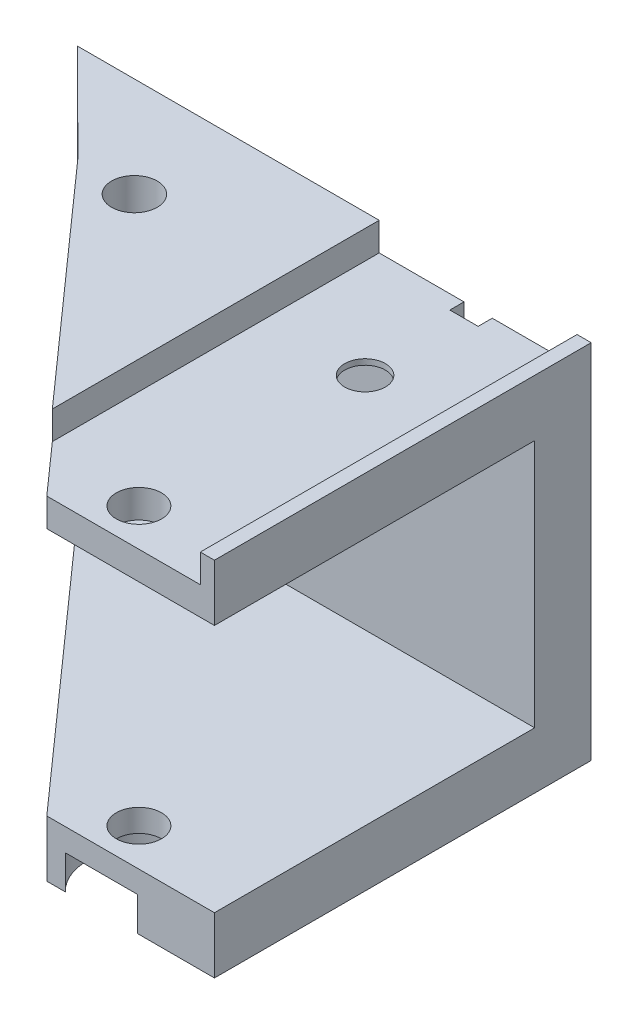
ISO-10303-21;
HEADER;
FILE_DESCRIPTION(('STEP AP214'),'2;1');
FILE_NAME('part.step','',(''),(''),'','','');
FILE_SCHEMA(('AUTOMOTIVE_DESIGN { 1 0 10303 214 1 1 1 1 }'));
ENDSEC;
DATA;
#1=APPLICATION_CONTEXT('core data for automotive mechanical design processes');
#2=APPLICATION_PROTOCOL_DEFINITION('international standard','automotive_design',2000,#1);
#3=PRODUCT_CONTEXT('',#1,'mechanical');
#4=PRODUCT('Part','Part','',(#3));
#5=PRODUCT_RELATED_PRODUCT_CATEGORY('part','',(#4));
#6=PRODUCT_DEFINITION_FORMATION('','',#4);
#7=PRODUCT_DEFINITION_CONTEXT('part definition',#1,'design');
#8=PRODUCT_DEFINITION('design','',#6,#7);
#9=PRODUCT_DEFINITION_SHAPE('','',#8);
#10=(LENGTH_UNIT() NAMED_UNIT(*) SI_UNIT(.MILLI.,.METRE.));
#11=(NAMED_UNIT(*) PLANE_ANGLE_UNIT() SI_UNIT($,.RADIAN.));
#12=(NAMED_UNIT(*) SI_UNIT($,.STERADIAN.) SOLID_ANGLE_UNIT());
#13=UNCERTAINTY_MEASURE_WITH_UNIT(LENGTH_MEASURE(1.E-05),#10,'distance_accuracy_value','');
#14=(GEOMETRIC_REPRESENTATION_CONTEXT(3) GLOBAL_UNCERTAINTY_ASSIGNED_CONTEXT((#13)) GLOBAL_UNIT_ASSIGNED_CONTEXT((#10,
#11,#12)) REPRESENTATION_CONTEXT('',''));
#15=CARTESIAN_POINT('',(0.,0.,0.));
#16=DIRECTION('',(0.,0.,1.));
#17=DIRECTION('',(1.,0.,0.));
#18=AXIS2_PLACEMENT_3D('',#15,#16,#17);
#19=CARTESIAN_POINT('',(38.1,-34.29,31.75));
#20=DIRECTION('',(0.,1.,0.));
#21=DIRECTION('',(0.,0.,1.));
#22=AXIS2_PLACEMENT_3D('',#19,#20,#21);
#23=CYLINDRICAL_SURFACE('',#22,2.54);
#24=CARTESIAN_POINT('',(38.1,-27.94,31.75));
#25=DIRECTION('',(0.,-1.,0.));
#26=DIRECTION('',(0.,0.,-1.));
#27=AXIS2_PLACEMENT_3D('',#24,#25,#26);
#28=CIRCLE('',#27,2.54);
#29=CARTESIAN_POINT('',(38.1,-27.94,29.21));
#30=VERTEX_POINT('',#29);
#31=EDGE_CURVE('E325',#30,#30,#28,.T.);
#32=ORIENTED_EDGE('',*,*,#31,.F.);
#33=EDGE_LOOP('',(#32));
#34=FACE_BOUND('',#33,.T.);
#35=CARTESIAN_POINT('',(38.1,-30.48,31.75));
#36=DIRECTION('',(0.,-1.,0.));
#37=DIRECTION('',(0.,0.,-1.));
#38=AXIS2_PLACEMENT_3D('',#35,#36,#37);
#39=CIRCLE('',#38,2.54);
#40=CARTESIAN_POINT('',(38.1,-30.48,29.21));
#41=VERTEX_POINT('',#40);
#42=EDGE_CURVE('E257',#41,#41,#39,.T.);
#43=ORIENTED_EDGE('',*,*,#42,.T.);
#44=EDGE_LOOP('',(#43));
#45=FACE_BOUND('',#44,.T.);
#46=ADVANCED_FACE('F43',(#34,#45),#23,.F.);
#47=CARTESIAN_POINT('',(0.,0.,-6.35));
#48=DIRECTION('',(0.,0.,-1.));
#49=DIRECTION('',(-1.,0.,0.));
#50=AXIS2_PLACEMENT_3D('',#47,#48,#49);
#51=PLANE('',#50);
#52=DIRECTION('',(0.,-1.,0.));
#53=VECTOR('',#52,1.);
#54=CARTESIAN_POINT('',(39.6875,3.175,-6.35));
#55=LINE('',#54,#53);
#56=CARTESIAN_POINT('',(39.6875,3.175,-6.35));
#57=VERTEX_POINT('',#56);
#58=CARTESIAN_POINT('',(39.6875,-34.29,-6.35));
#59=VERTEX_POINT('',#58);
#60=EDGE_CURVE('E272',#57,#59,#55,.T.);
#61=ORIENTED_EDGE('',*,*,#60,.F.);
#62=DIRECTION('',(-1.,0.,0.));
#63=VECTOR('',#62,1.);
#64=CARTESIAN_POINT('',(26.9875,3.175,-6.35));
#65=LINE('',#64,#63);
#66=CARTESIAN_POINT('',(49.2125,3.175,-6.35));
#67=VERTEX_POINT('',#66);
#68=EDGE_CURVE('E305',#67,#57,#65,.T.);
#69=ORIENTED_EDGE('',*,*,#68,.F.);
#70=DIRECTION('',(0.,1.,0.));
#71=VECTOR('',#70,1.);
#72=CARTESIAN_POINT('',(49.2125,3.175,-6.35));
#73=LINE('',#72,#71);
#74=CARTESIAN_POINT('',(49.2125,6.35,-6.35));
#75=VERTEX_POINT('',#74);
#76=EDGE_CURVE('E315',#67,#75,#73,.T.);
#77=ORIENTED_EDGE('',*,*,#76,.T.);
#78=DIRECTION('',(-1.,0.,0.));
#79=VECTOR('',#78,1.);
#80=CARTESIAN_POINT('',(0.,6.35,-6.35));
#81=LINE('',#80,#79);
#82=CARTESIAN_POINT('',(50.8,6.35,-6.35));
#83=VERTEX_POINT('',#82);
#84=EDGE_CURVE('E352',#83,#75,#81,.T.);
#85=ORIENTED_EDGE('',*,*,#84,.F.);
#86=DIRECTION('',(0.,1.,0.));
#87=VECTOR('',#86,1.);
#88=CARTESIAN_POINT('',(50.8,0.,-6.35));
#89=LINE('',#88,#87);
#90=CARTESIAN_POINT('',(50.8,-34.29,-6.35));
#91=VERTEX_POINT('',#90);
#92=EDGE_CURVE('E355',#91,#83,#89,.T.);
#93=ORIENTED_EDGE('',*,*,#92,.F.);
#94=DIRECTION('',(1.,0.,0.));
#95=VECTOR('',#94,1.);
#96=CARTESIAN_POINT('',(0.,-34.29,-6.35));
#97=LINE('',#96,#95);
#98=EDGE_CURVE('E195',#59,#91,#97,.T.);
#99=ORIENTED_EDGE('',*,*,#98,.F.);
#100=EDGE_LOOP('',(#61,#69,#77,#85,#93,#99));
#101=FACE_BOUND('',#100,.T.);
#102=ADVANCED_FACE('F392',(#101),#51,.T.);
#103=CARTESIAN_POINT('',(38.1,6.35,6.35));
#104=DIRECTION('',(0.,-1.,0.));
#105=DIRECTION('',(0.,0.,-1.));
#106=AXIS2_PLACEMENT_3D('',#103,#104,#105);
#107=CYLINDRICAL_SURFACE('',#106,2.28599999999999);
#108=CARTESIAN_POINT('',(38.1,2.54,6.35));
#109=DIRECTION('',(0.,-1.,0.));
#110=DIRECTION('',(0.,0.,-1.));
#111=AXIS2_PLACEMENT_3D('',#108,#109,#110);
#112=CIRCLE('',#111,2.28599999999999);
#113=CARTESIAN_POINT('',(38.1,2.54,4.06400000000001));
#114=VERTEX_POINT('',#113);
#115=EDGE_CURVE('E341',#114,#114,#112,.T.);
#116=ORIENTED_EDGE('',*,*,#115,.T.);
#117=EDGE_LOOP('',(#116));
#118=FACE_BOUND('',#117,.T.);
#119=CARTESIAN_POINT('',(38.1,3.175,6.35));
#120=DIRECTION('',(0.,1.,0.));
#121=DIRECTION('',(0.,0.,1.));
#122=AXIS2_PLACEMENT_3D('',#119,#120,#121);
#123=CIRCLE('',#122,2.28599999999999);
#124=CARTESIAN_POINT('',(38.1,3.175,8.636));
#125=VERTEX_POINT('',#124);
#126=EDGE_CURVE('E322',#125,#125,#123,.T.);
#127=ORIENTED_EDGE('',*,*,#126,.T.);
#128=EDGE_LOOP('',(#127));
#129=FACE_BOUND('',#128,.T.);
#130=ADVANCED_FACE('F400',(#118,#129),#107,.F.);
#131=CARTESIAN_POINT('',(0.,6.35,0.));
#132=DIRECTION('',(0.,-1.,0.));
#133=DIRECTION('',(0.,0.,-1.));
#134=AXIS2_PLACEMENT_3D('',#131,#132,#133);
#135=PLANE('',#134);
#136=CARTESIAN_POINT('',(10.6998859012606,6.35,4.85715743153037));
#137=DIRECTION('',(0.,1.,0.));
#138=DIRECTION('',(0.,0.,1.));
#139=AXIS2_PLACEMENT_3D('',#136,#137,#138);
#140=CIRCLE('',#139,2.56429102743881);
#141=CARTESIAN_POINT('',(10.6998859012606,6.35,7.42144845896918));
#142=VERTEX_POINT('',#141);
#143=EDGE_CURVE('E277',#142,#142,#140,.T.);
#144=ORIENTED_EDGE('',*,*,#143,.F.);
#145=EDGE_LOOP('',(#144));
#146=FACE_BOUND('',#145,.T.);
#147=CARTESIAN_POINT('',(26.9875,6.35,-6.35));
#148=VERTEX_POINT('',#147);
#149=CARTESIAN_POINT('',(-6.91548589679075,6.35,-6.35));
#150=VERTEX_POINT('',#149);
#151=EDGE_CURVE('E351',#148,#150,#81,.T.);
#152=ORIENTED_EDGE('',*,*,#151,.T.);
#153=DIRECTION('',(0.709263598483506,0.,0.704943365006174));
#154=VECTOR('',#153,1.);
#155=CARTESIAN_POINT('',(-6.91548589679075,6.35,-6.35));
#156=LINE('',#155,#154);
#157=CARTESIAN_POINT('',(3.99235643502804,6.35,4.49140098940655));
#158=VERTEX_POINT('',#157);
#159=EDGE_CURVE('E211',#150,#158,#156,.T.);
#160=ORIENTED_EDGE('',*,*,#159,.T.);
#161=DIRECTION('',(0.66436383882992,0.,0.74740931868366));
#162=VECTOR('',#161,1.);
#163=CARTESIAN_POINT('',(50.8,6.35,57.15));
#164=LINE('',#163,#162);
#165=CARTESIAN_POINT('',(26.9875,6.35,30.3609375));
#166=VERTEX_POINT('',#165);
#167=EDGE_CURVE('E362',#158,#166,#164,.T.);
#168=ORIENTED_EDGE('',*,*,#167,.T.);
#169=DIRECTION('',(0.,0.,1.));
#170=VECTOR('',#169,1.);
#171=CARTESIAN_POINT('',(26.9875,6.35,-6.35));
#172=LINE('',#171,#170);
#173=EDGE_CURVE('E294',#148,#166,#172,.T.);
#174=ORIENTED_EDGE('',*,*,#173,.F.);
#175=EDGE_LOOP('',(#152,#160,#168,#174));
#176=FACE_BOUND('',#175,.T.);
#177=ADVANCED_FACE('F427',(#146,#176),#135,.F.);
#178=CARTESIAN_POINT('',(38.1,6.35,31.75));
#179=DIRECTION('',(0.,-1.,0.));
#180=DIRECTION('',(0.,0.,-1.));
#181=AXIS2_PLACEMENT_3D('',#178,#179,#180);
#182=CYLINDRICAL_SURFACE('',#181,2.54);
#183=CARTESIAN_POINT('',(38.1,0.,31.75));
#184=DIRECTION('',(0.,1.,0.));
#185=DIRECTION('',(0.,0.,1.));
#186=AXIS2_PLACEMENT_3D('',#183,#184,#185);
#187=CIRCLE('',#186,2.54);
#188=CARTESIAN_POINT('',(38.1,0.,34.29));
#189=VERTEX_POINT('',#188);
#190=EDGE_CURVE('E358',#189,#189,#187,.T.);
#191=ORIENTED_EDGE('',*,*,#190,.F.);
#192=EDGE_LOOP('',(#191));
#193=FACE_BOUND('',#192,.T.);
#194=CARTESIAN_POINT('',(38.1,3.175,31.75));
#195=DIRECTION('',(0.,1.,0.));
#196=DIRECTION('',(0.,0.,1.));
#197=AXIS2_PLACEMENT_3D('',#194,#195,#196);
#198=CIRCLE('',#197,2.54);
#199=CARTESIAN_POINT('',(38.1,3.175,34.29));
#200=VERTEX_POINT('',#199);
#201=EDGE_CURVE('E314',#200,#200,#198,.T.);
#202=ORIENTED_EDGE('',*,*,#201,.T.);
#203=EDGE_LOOP('',(#202));
#204=FACE_BOUND('',#203,.T.);
#205=ADVANCED_FACE('F423',(#193,#204),#182,.F.);
#206=CARTESIAN_POINT('',(0.,0.,0.));
#207=DIRECTION('',(0.,-1.,0.));
#208=DIRECTION('',(0.,0.,-1.));
#209=AXIS2_PLACEMENT_3D('',#206,#207,#208);
#210=PLANE('',#209);
#211=DIRECTION('',(1.,0.,0.));
#212=VECTOR('',#211,1.);
#213=CARTESIAN_POINT('',(0.,0.,35.9671105164697));
#214=LINE('',#213,#212);
#215=CARTESIAN_POINT('',(31.9707649035286,0.,35.9671105164697));
#216=VERTEX_POINT('',#215);
#217=CARTESIAN_POINT('',(50.8,0.,35.9671105164697));
#218=VERTEX_POINT('',#217);
#219=EDGE_CURVE('E238',#216,#218,#214,.T.);
#220=ORIENTED_EDGE('',*,*,#219,.F.);
#221=DIRECTION('',(0.66436383882992,0.,0.74740931868366));
#222=VECTOR('',#221,1.);
#223=CARTESIAN_POINT('',(50.8,0.,57.15));
#224=LINE('',#223,#222);
#225=CARTESIAN_POINT('',(3.99235643502804,0.,4.49140098940655));
#226=VERTEX_POINT('',#225);
#227=EDGE_CURVE('E361',#226,#216,#224,.T.);
#228=ORIENTED_EDGE('',*,*,#227,.F.);
#229=DIRECTION('',(-0.707106781186546,0.,0.707106781186549));
#230=VECTOR('',#229,1.);
#231=CARTESIAN_POINT('',(4.2418787122173,0.,4.24187871221729));
#232=LINE('',#231,#230);
#233=CARTESIAN_POINT('',(8.48375742443458,0.,0.));
#234=VERTEX_POINT('',#233);
#235=EDGE_CURVE('E251',#234,#226,#232,.T.);
#236=ORIENTED_EDGE('',*,*,#235,.F.);
#237=DIRECTION('',(1.,0.,0.));
#238=VECTOR('',#237,1.);
#239=CARTESIAN_POINT('',(50.8,0.,0.));
#240=LINE('',#239,#238);
#241=CARTESIAN_POINT('',(38.1,0.,0.));
#242=VERTEX_POINT('',#241);
#243=EDGE_CURVE('E349',#234,#242,#240,.T.);
#244=ORIENTED_EDGE('',*,*,#243,.T.);
#245=CARTESIAN_POINT('',(38.1,0.,6.35));
#246=DIRECTION('',(0.,-1.,0.));
#247=DIRECTION('',(0.,0.,-1.));
#248=AXIS2_PLACEMENT_3D('',#245,#246,#247);
#249=CIRCLE('',#248,6.35);
#250=EDGE_CURVE('E338',#242,#242,#249,.F.);
#251=ORIENTED_EDGE('',*,*,#250,.T.);
#252=CARTESIAN_POINT('',(50.8,0.,0.));
#253=VERTEX_POINT('',#252);
#254=EDGE_CURVE('E348',#242,#253,#240,.T.);
#255=ORIENTED_EDGE('',*,*,#254,.T.);
#256=DIRECTION('',(0.,0.,-1.));
#257=VECTOR('',#256,1.);
#258=CARTESIAN_POINT('',(50.8,0.,0.));
#259=LINE('',#258,#257);
#260=EDGE_CURVE('E364',#218,#253,#259,.T.);
#261=ORIENTED_EDGE('',*,*,#260,.F.);
#262=EDGE_LOOP('',(#220,#228,#236,#244,#251,#255,#261));
#263=FACE_BOUND('',#262,.T.);
#264=CARTESIAN_POINT('',(10.6998859012606,0.,4.85715743153037));
#265=DIRECTION('',(0.,-1.,0.));
#266=DIRECTION('',(0.,0.,-1.));
#267=AXIS2_PLACEMENT_3D('',#264,#265,#266);
#268=CIRCLE('',#267,2.56429102743881);
#269=CARTESIAN_POINT('',(10.6998859012606,0.,2.29286640409156));
#270=VERTEX_POINT('',#269);
#271=EDGE_CURVE('E291',#270,#270,#268,.T.);
#272=ORIENTED_EDGE('',*,*,#271,.F.);
#273=EDGE_LOOP('',(#272));
#274=FACE_BOUND('',#273,.T.);
#275=ORIENTED_EDGE('',*,*,#190,.T.);
#276=EDGE_LOOP('',(#275));
#277=FACE_BOUND('',#276,.T.);
#278=ADVANCED_FACE('F426',(#263,#274,#277),#210,.T.);
#279=DIRECTION('',(0.,0.,-1.));
#280=VECTOR('',#279,1.);
#281=CARTESIAN_POINT('',(49.2125,6.35,-6.35));
#282=LINE('',#281,#280);
#283=CARTESIAN_POINT('',(49.2125,6.35,35.9671105164697));
#284=VERTEX_POINT('',#283);
#285=EDGE_CURVE('E299',#284,#75,#282,.T.);
#286=ORIENTED_EDGE('',*,*,#285,.F.);
#287=DIRECTION('',(-1.,0.,0.));
#288=VECTOR('',#287,1.);
#289=CARTESIAN_POINT('',(50.8,6.35,35.9671105164697));
#290=LINE('',#289,#288);
#291=CARTESIAN_POINT('',(50.8,6.35,35.9671105164697));
#292=VERTEX_POINT('',#291);
#293=EDGE_CURVE('E221',#292,#284,#290,.T.);
#294=ORIENTED_EDGE('',*,*,#293,.F.);
#295=DIRECTION('',(0.,0.,-1.));
#296=VECTOR('',#295,1.);
#297=CARTESIAN_POINT('',(50.8,6.35,0.));
#298=LINE('',#297,#296);
#299=EDGE_CURVE('E51',#292,#83,#298,.T.);
#300=ORIENTED_EDGE('',*,*,#299,.T.);
#301=ORIENTED_EDGE('',*,*,#84,.T.);
#302=EDGE_LOOP('',(#286,#294,#300,#301));
#303=FACE_BOUND('',#302,.T.);
#304=ADVANCED_FACE('F432',(#303),#135,.F.);
#305=CARTESIAN_POINT('',(50.8,6.35,57.15));
#306=DIRECTION('',(0.74740931868366,0.,-0.66436383882992));
#307=DIRECTION('',(-0.66436383882992,0.,-0.74740931868366));
#308=AXIS2_PLACEMENT_3D('',#305,#306,#307);
#309=PLANE('',#308);
#310=ORIENTED_EDGE('',*,*,#227,.T.);
#311=DIRECTION('',(0.,1.,0.));
#312=VECTOR('',#311,1.);
#313=CARTESIAN_POINT('',(31.9707649035286,6.35,35.9671105164697));
#314=LINE('',#313,#312);
#315=CARTESIAN_POINT('',(31.9707649035286,3.175,35.9671105164697));
#316=VERTEX_POINT('',#315);
#317=EDGE_CURVE('E235',#216,#316,#314,.T.);
#318=ORIENTED_EDGE('',*,*,#317,.T.);
#319=DIRECTION('',(0.66436383882992,0.,0.74740931868366));
#320=VECTOR('',#319,1.);
#321=CARTESIAN_POINT('',(49.2125,3.175,55.3640625));
#322=LINE('',#321,#320);
#323=CARTESIAN_POINT('',(26.9875,3.175,30.3609375));
#324=VERTEX_POINT('',#323);
#325=EDGE_CURVE('E298',#324,#316,#322,.T.);
#326=ORIENTED_EDGE('',*,*,#325,.F.);
#327=DIRECTION('',(0.,1.,0.));
#328=VECTOR('',#327,1.);
#329=CARTESIAN_POINT('',(26.9875,3.175,30.3609375));
#330=LINE('',#329,#328);
#331=EDGE_CURVE('E308',#324,#166,#330,.T.);
#332=ORIENTED_EDGE('',*,*,#331,.T.);
#333=ORIENTED_EDGE('',*,*,#167,.F.);
#334=DIRECTION('',(0.,1.,0.));
#335=VECTOR('',#334,1.);
#336=CARTESIAN_POINT('',(3.99235643502804,-34.29,4.49140098940655));
#337=LINE('',#336,#335);
#338=EDGE_CURVE('E227',#226,#158,#337,.T.);
#339=ORIENTED_EDGE('',*,*,#338,.F.);
#340=EDGE_LOOP('',(#310,#318,#326,#332,#333,#339));
#341=FACE_BOUND('',#340,.T.);
#342=ADVANCED_FACE('F45',(#341),#309,.F.);
#343=CARTESIAN_POINT('',(50.8,6.35,0.));
#344=DIRECTION('',(-1.,0.,0.));
#345=DIRECTION('',(0.,0.,1.));
#346=AXIS2_PLACEMENT_3D('',#343,#344,#345);
#347=PLANE('',#346);
#348=ORIENTED_EDGE('',*,*,#299,.F.);
#349=DIRECTION('',(0.,1.,0.));
#350=VECTOR('',#349,1.);
#351=CARTESIAN_POINT('',(50.8,-34.29,35.9671105164697));
#352=LINE('',#351,#350);
#353=EDGE_CURVE('E219',#218,#292,#352,.T.);
#354=ORIENTED_EDGE('',*,*,#353,.F.);
#355=ORIENTED_EDGE('',*,*,#260,.T.);
#356=DIRECTION('',(0.,-1.,0.));
#357=VECTOR('',#356,1.);
#358=CARTESIAN_POINT('',(50.8,0.,0.));
#359=LINE('',#358,#357);
#360=CARTESIAN_POINT('',(50.8,-27.94,0.));
#361=VERTEX_POINT('',#360);
#362=EDGE_CURVE('E342',#253,#361,#359,.T.);
#363=ORIENTED_EDGE('',*,*,#362,.T.);
#364=DIRECTION('',(0.,0.,-1.));
#365=VECTOR('',#364,1.);
#366=CARTESIAN_POINT('',(50.8,-27.94,0.));
#367=LINE('',#366,#365);
#368=CARTESIAN_POINT('',(50.8,-27.94,35.9671105164697));
#369=VERTEX_POINT('',#368);
#370=EDGE_CURVE('E332',#369,#361,#367,.T.);
#371=ORIENTED_EDGE('',*,*,#370,.F.);
#372=CARTESIAN_POINT('',(50.8,-34.29,35.9671105164697));
#373=VERTEX_POINT('',#372);
#374=EDGE_CURVE('E224',#373,#369,#352,.T.);
#375=ORIENTED_EDGE('',*,*,#374,.F.);
#376=DIRECTION('',(0.,0.,-1.));
#377=VECTOR('',#376,1.);
#378=CARTESIAN_POINT('',(50.8,-34.29,0.));
#379=LINE('',#378,#377);
#380=EDGE_CURVE('E326',#373,#91,#379,.T.);
#381=ORIENTED_EDGE('',*,*,#380,.T.);
#382=ORIENTED_EDGE('',*,*,#92,.T.);
#383=EDGE_LOOP('',(#348,#354,#355,#363,#371,#375,#381,#382));
#384=FACE_BOUND('',#383,.T.);
#385=ADVANCED_FACE('F422',(#384),#347,.F.);
#386=CARTESIAN_POINT('',(-6.91548589679075,-34.29,-6.35));
#387=VERTEX_POINT('',#386);
#388=CARTESIAN_POINT('',(36.5125,-34.29,-6.35));
#389=VERTEX_POINT('',#388);
#390=EDGE_CURVE('E182',#387,#389,#97,.T.);
#391=ORIENTED_EDGE('',*,*,#390,.F.);
#392=DIRECTION('',(0.,1.,0.));
#393=VECTOR('',#392,1.);
#394=CARTESIAN_POINT('',(-6.91548589679075,-58.5915546922202,-6.35));
#395=LINE('',#394,#393);
#396=EDGE_CURVE('E187',#387,#150,#395,.T.);
#397=ORIENTED_EDGE('',*,*,#396,.T.);
#398=ORIENTED_EDGE('',*,*,#151,.F.);
#399=DIRECTION('',(0.,1.,0.));
#400=VECTOR('',#399,1.);
#401=CARTESIAN_POINT('',(26.9875,3.175,-6.35));
#402=LINE('',#401,#400);
#403=CARTESIAN_POINT('',(26.9875,3.175,-6.35));
#404=VERTEX_POINT('',#403);
#405=EDGE_CURVE('E312',#404,#148,#402,.T.);
#406=ORIENTED_EDGE('',*,*,#405,.F.);
#407=CARTESIAN_POINT('',(36.5125,3.175,-6.35));
#408=VERTEX_POINT('',#407);
#409=EDGE_CURVE('E304',#408,#404,#65,.T.);
#410=ORIENTED_EDGE('',*,*,#409,.F.);
#411=DIRECTION('',(0.,1.,0.));
#412=VECTOR('',#411,1.);
#413=CARTESIAN_POINT('',(36.5125,3.175,-6.35));
#414=LINE('',#413,#412);
#415=EDGE_CURVE('E190',#389,#408,#414,.T.);
#416=ORIENTED_EDGE('',*,*,#415,.F.);
#417=EDGE_LOOP('',(#391,#397,#398,#406,#410,#416));
#418=FACE_BOUND('',#417,.T.);
#419=ADVANCED_FACE('F184',(#418),#51,.T.);
#420=CARTESIAN_POINT('',(0.,0.,0.));
#421=DIRECTION('',(0.,0.,-1.));
#422=DIRECTION('',(-1.,0.,0.));
#423=AXIS2_PLACEMENT_3D('',#420,#421,#422);
#424=PLANE('',#423);
#425=ORIENTED_EDGE('',*,*,#243,.F.);
#426=DIRECTION('',(0.,-1.,0.));
#427=VECTOR('',#426,1.);
#428=CARTESIAN_POINT('',(8.48375742443458,0.,0.));
#429=LINE('',#428,#427);
#430=CARTESIAN_POINT('',(8.48375742443458,-27.94,0.));
#431=VERTEX_POINT('',#430);
#432=EDGE_CURVE('E248',#234,#431,#429,.T.);
#433=ORIENTED_EDGE('',*,*,#432,.T.);
#434=DIRECTION('',(-1.,0.,0.));
#435=VECTOR('',#434,1.);
#436=CARTESIAN_POINT('',(50.8,-27.94,0.));
#437=LINE('',#436,#435);
#438=EDGE_CURVE('E345',#361,#431,#437,.T.);
#439=ORIENTED_EDGE('',*,*,#438,.F.);
#440=ORIENTED_EDGE('',*,*,#362,.F.);
#441=ORIENTED_EDGE('',*,*,#254,.F.);
#442=EDGE_LOOP('',(#425,#433,#439,#440,#441));
#443=FACE_BOUND('',#442,.T.);
#444=ADVANCED_FACE('F416',(#443),#424,.F.);
#445=CARTESIAN_POINT('',(38.1,-38.1,6.35));
#446=DIRECTION('',(0.,1.,0.));
#447=DIRECTION('',(0.,0.,1.));
#448=AXIS2_PLACEMENT_3D('',#445,#446,#447);
#449=CYLINDRICAL_SURFACE('',#448,6.35);
#450=ORIENTED_EDGE('',*,*,#250,.F.);
#451=EDGE_LOOP('',(#450));
#452=FACE_BOUND('',#451,.T.);
#453=CARTESIAN_POINT('',(38.1,2.54,6.35));
#454=DIRECTION('',(0.,-1.,0.));
#455=DIRECTION('',(0.,0.,-1.));
#456=AXIS2_PLACEMENT_3D('',#453,#454,#455);
#457=CIRCLE('',#456,6.35);
#458=CARTESIAN_POINT('',(38.1,2.54,0.));
#459=VERTEX_POINT('',#458);
#460=EDGE_CURVE('E194',#459,#459,#457,.T.);
#461=ORIENTED_EDGE('',*,*,#460,.F.);
#462=EDGE_LOOP('',(#461));
#463=FACE_BOUND('',#462,.T.);
#464=ADVANCED_FACE('F412',(#452,#463),#449,.F.);
#465=CARTESIAN_POINT('',(38.1,2.54,6.35));
#466=DIRECTION('',(0.,-1.,0.));
#467=DIRECTION('',(0.,0.,-1.));
#468=AXIS2_PLACEMENT_3D('',#465,#466,#467);
#469=PLANE('',#468);
#470=ORIENTED_EDGE('',*,*,#115,.F.);
#471=EDGE_LOOP('',(#470));
#472=FACE_BOUND('',#471,.T.);
#473=ORIENTED_EDGE('',*,*,#460,.T.);
#474=EDGE_LOOP('',(#473));
#475=FACE_BOUND('',#474,.T.);
#476=ADVANCED_FACE('F408',(#472,#475),#469,.T.);
#477=CARTESIAN_POINT('',(0.,-27.94,0.));
#478=DIRECTION('',(0.,-1.,0.));
#479=DIRECTION('',(0.,0.,-1.));
#480=AXIS2_PLACEMENT_3D('',#477,#478,#479);
#481=PLANE('',#480);
#482=CARTESIAN_POINT('',(10.6998859012606,-27.94,4.85715743153037));
#483=DIRECTION('',(0.,-1.,0.));
#484=DIRECTION('',(0.,0.,-1.));
#485=AXIS2_PLACEMENT_3D('',#482,#483,#484);
#486=CIRCLE('',#485,2.56429102743881);
#487=CARTESIAN_POINT('',(10.6998859012606,-27.94,2.29286640409156));
#488=VERTEX_POINT('',#487);
#489=EDGE_CURVE('E288',#488,#488,#486,.T.);
#490=ORIENTED_EDGE('',*,*,#489,.T.);
#491=EDGE_LOOP('',(#490));
#492=FACE_BOUND('',#491,.T.);
#493=ORIENTED_EDGE('',*,*,#31,.T.);
#494=EDGE_LOOP('',(#493));
#495=FACE_BOUND('',#494,.T.);
#496=DIRECTION('',(0.66436383882992,0.,0.74740931868366));
#497=VECTOR('',#496,1.);
#498=CARTESIAN_POINT('',(0.,-27.94,0.));
#499=LINE('',#498,#497);
#500=CARTESIAN_POINT('',(3.99235643502804,-27.94,4.49140098940655));
#501=VERTEX_POINT('',#500);
#502=CARTESIAN_POINT('',(31.9707649035286,-27.94,35.9671105164697));
#503=VERTEX_POINT('',#502);
#504=EDGE_CURVE('E328',#501,#503,#499,.T.);
#505=ORIENTED_EDGE('',*,*,#504,.T.);
#506=DIRECTION('',(1.,0.,0.));
#507=VECTOR('',#506,1.);
#508=CARTESIAN_POINT('',(0.,-27.94,35.9671105164697));
#509=LINE('',#508,#507);
#510=EDGE_CURVE('E242',#503,#369,#509,.T.);
#511=ORIENTED_EDGE('',*,*,#510,.T.);
#512=ORIENTED_EDGE('',*,*,#370,.T.);
#513=ORIENTED_EDGE('',*,*,#438,.T.);
#514=DIRECTION('',(-0.707106781186546,0.,0.707106781186549));
#515=VECTOR('',#514,1.);
#516=CARTESIAN_POINT('',(4.2418787122173,-27.94,4.24187871221729));
#517=LINE('',#516,#515);
#518=EDGE_CURVE('E245',#431,#501,#517,.T.);
#519=ORIENTED_EDGE('',*,*,#518,.T.);
#520=EDGE_LOOP('',(#505,#511,#512,#513,#519));
#521=FACE_BOUND('',#520,.T.);
#522=ADVANCED_FACE('F411',(#492,#495,#521),#481,.F.);
#523=CARTESIAN_POINT('',(0.,-34.29,0.));
#524=DIRECTION('',(-0.74740931868366,0.,0.66436383882992));
#525=DIRECTION('',(0.66436383882992,0.,0.74740931868366));
#526=AXIS2_PLACEMENT_3D('',#523,#524,#525);
#527=PLANE('',#526);
#528=DIRECTION('',(0.,-1.,0.));
#529=VECTOR('',#528,1.);
#530=CARTESIAN_POINT('',(31.9707649035286,-34.29,35.9671105164697));
#531=LINE('',#530,#529);
#532=CARTESIAN_POINT('',(31.9707649035286,-34.29,35.9671105164697));
#533=VERTEX_POINT('',#532);
#534=EDGE_CURVE('E240',#503,#533,#531,.T.);
#535=ORIENTED_EDGE('',*,*,#534,.F.);
#536=ORIENTED_EDGE('',*,*,#504,.F.);
#537=CARTESIAN_POINT('',(3.99235643502805,-34.29,4.49140098940655));
#538=VERTEX_POINT('',#537);
#539=EDGE_CURVE('E223',#538,#501,#337,.T.);
#540=ORIENTED_EDGE('',*,*,#539,.F.);
#541=DIRECTION('',(0.66436383882992,0.,0.74740931868366));
#542=VECTOR('',#541,1.);
#543=CARTESIAN_POINT('',(0.,-34.29,0.));
#544=LINE('',#543,#542);
#545=EDGE_CURVE('E203',#538,#533,#544,.T.);
#546=ORIENTED_EDGE('',*,*,#545,.T.);
#547=EDGE_LOOP('',(#535,#536,#540,#546));
#548=FACE_BOUND('',#547,.T.);
#549=ADVANCED_FACE('F406',(#548),#527,.T.);
#550=CARTESIAN_POINT('',(0.,-34.29,0.));
#551=DIRECTION('',(0.,-1.,0.));
#552=DIRECTION('',(0.,0.,-1.));
#553=AXIS2_PLACEMENT_3D('',#550,#551,#552);
#554=PLANE('',#553);
#555=DIRECTION('',(-1.,0.,0.));
#556=VECTOR('',#555,1.);
#557=CARTESIAN_POINT('',(50.8,-34.29,35.9671105164697));
#558=LINE('',#557,#556);
#559=CARTESIAN_POINT('',(34.0571120604349,-34.29,35.9671105164697));
#560=VERTEX_POINT('',#559);
#561=EDGE_CURVE('E220',#560,#533,#558,.T.);
#562=ORIENTED_EDGE('',*,*,#561,.T.);
#563=ORIENTED_EDGE('',*,*,#545,.F.);
#564=DIRECTION('',(0.709263598483506,0.,0.704943365006174));
#565=VECTOR('',#564,1.);
#566=CARTESIAN_POINT('',(-6.91548589679075,-34.29,-6.35));
#567=LINE('',#566,#565);
#568=EDGE_CURVE('E198',#387,#538,#567,.T.);
#569=ORIENTED_EDGE('',*,*,#568,.F.);
#570=ORIENTED_EDGE('',*,*,#390,.T.);
#571=DIRECTION('',(0.,0.,-1.));
#572=VECTOR('',#571,1.);
#573=CARTESIAN_POINT('',(36.5125,-34.29,-4.7625));
#574=LINE('',#573,#572);
#575=CARTESIAN_POINT('',(36.5125,-34.29,-4.7625));
#576=VERTEX_POINT('',#575);
#577=EDGE_CURVE('E281',#576,#389,#574,.T.);
#578=ORIENTED_EDGE('',*,*,#577,.F.);
#579=DIRECTION('',(-1.,0.,0.));
#580=VECTOR('',#579,1.);
#581=CARTESIAN_POINT('',(39.6875,-34.29,-4.7625));
#582=LINE('',#581,#580);
#583=CARTESIAN_POINT('',(39.6875,-34.29,-4.7625));
#584=VERTEX_POINT('',#583);
#585=EDGE_CURVE('E263',#584,#576,#582,.T.);
#586=ORIENTED_EDGE('',*,*,#585,.F.);
#587=DIRECTION('',(0.,0.,-1.));
#588=VECTOR('',#587,1.);
#589=CARTESIAN_POINT('',(39.6875,-34.29,-4.7625));
#590=LINE('',#589,#588);
#591=EDGE_CURVE('E271',#584,#59,#590,.T.);
#592=ORIENTED_EDGE('',*,*,#591,.T.);
#593=ORIENTED_EDGE('',*,*,#98,.T.);
#594=ORIENTED_EDGE('',*,*,#380,.F.);
#595=CARTESIAN_POINT('',(42.1428879395651,-34.29,35.9671105164697));
#596=VERTEX_POINT('',#595);
#597=EDGE_CURVE('E216',#373,#596,#558,.T.);
#598=ORIENTED_EDGE('',*,*,#597,.T.);
#599=CARTESIAN_POINT('',(38.1,-34.29,31.75));
#600=DIRECTION('',(0.,-1.,0.));
#601=DIRECTION('',(0.,0.,-1.));
#602=AXIS2_PLACEMENT_3D('',#599,#600,#601);
#603=CIRCLE('',#602,5.842);
#604=EDGE_CURVE('E253',#560,#596,#603,.T.);
#605=ORIENTED_EDGE('',*,*,#604,.F.);
#606=EDGE_LOOP('',(#562,#563,#569,#570,#578,#586,#592,#593,#594,#598,#605));
#607=FACE_BOUND('',#606,.T.);
#608=CARTESIAN_POINT('',(10.6998859012606,-34.29,4.85715743153037));
#609=DIRECTION('',(0.,-1.,0.));
#610=DIRECTION('',(0.,0.,-1.));
#611=AXIS2_PLACEMENT_3D('',#608,#609,#610);
#612=CIRCLE('',#611,2.56429102743881);
#613=CARTESIAN_POINT('',(10.6998859012606,-34.29,2.29286640409156));
#614=VERTEX_POINT('',#613);
#615=EDGE_CURVE('E287',#614,#614,#612,.T.);
#616=ORIENTED_EDGE('',*,*,#615,.F.);
#617=EDGE_LOOP('',(#616));
#618=FACE_BOUND('',#617,.T.);
#619=ADVANCED_FACE('F200',(#607,#618),#554,.T.);
#620=CARTESIAN_POINT('',(26.9875,3.175,-6.35));
#621=DIRECTION('',(-1.,0.,0.));
#622=DIRECTION('',(0.,0.,1.));
#623=AXIS2_PLACEMENT_3D('',#620,#621,#622);
#624=PLANE('',#623);
#625=ORIENTED_EDGE('',*,*,#173,.T.);
#626=ORIENTED_EDGE('',*,*,#331,.F.);
#627=DIRECTION('',(0.,0.,1.));
#628=VECTOR('',#627,1.);
#629=CARTESIAN_POINT('',(26.9875,3.175,-6.35));
#630=LINE('',#629,#628);
#631=EDGE_CURVE('E295',#404,#324,#630,.T.);
#632=ORIENTED_EDGE('',*,*,#631,.F.);
#633=ORIENTED_EDGE('',*,*,#405,.T.);
#634=EDGE_LOOP('',(#625,#626,#632,#633));
#635=FACE_BOUND('',#634,.T.);
#636=ADVANCED_FACE('F545',(#635),#624,.F.);
#637=CARTESIAN_POINT('',(49.2125,3.175,-6.35));
#638=DIRECTION('',(1.,0.,0.));
#639=DIRECTION('',(0.,0.,-1.));
#640=AXIS2_PLACEMENT_3D('',#637,#638,#639);
#641=PLANE('',#640);
#642=DIRECTION('',(0.,0.,-1.));
#643=VECTOR('',#642,1.);
#644=CARTESIAN_POINT('',(49.2125,3.175,-6.35));
#645=LINE('',#644,#643);
#646=CARTESIAN_POINT('',(49.2125,3.175,35.9671105164697));
#647=VERTEX_POINT('',#646);
#648=EDGE_CURVE('E302',#647,#67,#645,.T.);
#649=ORIENTED_EDGE('',*,*,#648,.F.);
#650=DIRECTION('',(0.,1.,0.));
#651=VECTOR('',#650,1.);
#652=CARTESIAN_POINT('',(49.2125,3.175,35.9671105164697));
#653=LINE('',#652,#651);
#654=EDGE_CURVE('E58',#647,#284,#653,.T.);
#655=ORIENTED_EDGE('',*,*,#654,.T.);
#656=ORIENTED_EDGE('',*,*,#285,.T.);
#657=ORIENTED_EDGE('',*,*,#76,.F.);
#658=EDGE_LOOP('',(#649,#655,#656,#657));
#659=FACE_BOUND('',#658,.T.);
#660=ADVANCED_FACE('F453',(#659),#641,.F.);
#661=CARTESIAN_POINT('',(0.,3.175,0.));
#662=DIRECTION('',(0.,1.,0.));
#663=DIRECTION('',(0.,0.,1.));
#664=AXIS2_PLACEMENT_3D('',#661,#662,#663);
#665=PLANE('',#664);
#666=DIRECTION('',(-1.,0.,0.));
#667=VECTOR('',#666,1.);
#668=CARTESIAN_POINT('',(0.,3.175,35.9671105164697));
#669=LINE('',#668,#667);
#670=EDGE_CURVE('E232',#647,#316,#669,.T.);
#671=ORIENTED_EDGE('',*,*,#670,.F.);
#672=ORIENTED_EDGE('',*,*,#648,.T.);
#673=ORIENTED_EDGE('',*,*,#68,.T.);
#674=DIRECTION('',(0.,0.,-1.));
#675=VECTOR('',#674,1.);
#676=CARTESIAN_POINT('',(39.6875,3.175,-4.7625));
#677=LINE('',#676,#675);
#678=CARTESIAN_POINT('',(39.6875,3.175,-4.7625));
#679=VERTEX_POINT('',#678);
#680=EDGE_CURVE('E275',#679,#57,#677,.T.);
#681=ORIENTED_EDGE('',*,*,#680,.F.);
#682=DIRECTION('',(1.,0.,0.));
#683=VECTOR('',#682,1.);
#684=CARTESIAN_POINT('',(39.6875,3.175,-4.7625));
#685=LINE('',#684,#683);
#686=CARTESIAN_POINT('',(36.5125,3.175,-4.7625));
#687=VERTEX_POINT('',#686);
#688=EDGE_CURVE('E268',#687,#679,#685,.T.);
#689=ORIENTED_EDGE('',*,*,#688,.F.);
#690=DIRECTION('',(0.,0.,-1.));
#691=VECTOR('',#690,1.);
#692=CARTESIAN_POINT('',(36.5125,3.175,-4.7625));
#693=LINE('',#692,#691);
#694=EDGE_CURVE('E278',#687,#408,#693,.T.);
#695=ORIENTED_EDGE('',*,*,#694,.T.);
#696=ORIENTED_EDGE('',*,*,#409,.T.);
#697=ORIENTED_EDGE('',*,*,#631,.T.);
#698=ORIENTED_EDGE('',*,*,#325,.T.);
#699=EDGE_LOOP('',(#671,#672,#673,#681,#689,#695,#696,#697,#698));
#700=FACE_BOUND('',#699,.T.);
#701=ORIENTED_EDGE('',*,*,#126,.F.);
#702=EDGE_LOOP('',(#701));
#703=FACE_BOUND('',#702,.T.);
#704=ORIENTED_EDGE('',*,*,#201,.F.);
#705=EDGE_LOOP('',(#704));
#706=FACE_BOUND('',#705,.T.);
#707=ADVANCED_FACE('F457',(#700,#703,#706),#665,.T.);
#708=CARTESIAN_POINT('',(10.6998859012606,-120.65,4.85715743153037));
#709=DIRECTION('',(0.,1.,0.));
#710=DIRECTION('',(0.,0.,1.));
#711=AXIS2_PLACEMENT_3D('',#708,#709,#710);
#712=CYLINDRICAL_SURFACE('',#711,2.56429102743881);
#713=ORIENTED_EDGE('',*,*,#615,.T.);
#714=EDGE_LOOP('',(#713));
#715=FACE_BOUND('',#714,.T.);
#716=ORIENTED_EDGE('',*,*,#489,.F.);
#717=EDGE_LOOP('',(#716));
#718=FACE_BOUND('',#717,.T.);
#719=ADVANCED_FACE('F618',(#715,#718),#712,.F.);
#720=ORIENTED_EDGE('',*,*,#271,.T.);
#721=EDGE_LOOP('',(#720));
#722=FACE_BOUND('',#721,.T.);
#723=ORIENTED_EDGE('',*,*,#143,.T.);
#724=EDGE_LOOP('',(#723));
#725=FACE_BOUND('',#724,.T.);
#726=ADVANCED_FACE('F602',(#722,#725),#712,.F.);
#727=CARTESIAN_POINT('',(39.6875,3.175,-4.7625));
#728=DIRECTION('',(1.,0.,0.));
#729=DIRECTION('',(0.,1.,0.));
#730=AXIS2_PLACEMENT_3D('',#727,#728,#729);
#731=PLANE('',#730);
#732=ORIENTED_EDGE('',*,*,#60,.T.);
#733=ORIENTED_EDGE('',*,*,#591,.F.);
#734=DIRECTION('',(0.,-1.,0.));
#735=VECTOR('',#734,1.);
#736=CARTESIAN_POINT('',(39.6875,3.175,-4.7625));
#737=LINE('',#736,#735);
#738=EDGE_CURVE('E260',#679,#584,#737,.T.);
#739=ORIENTED_EDGE('',*,*,#738,.F.);
#740=ORIENTED_EDGE('',*,*,#680,.T.);
#741=EDGE_LOOP('',(#732,#733,#739,#740));
#742=FACE_BOUND('',#741,.T.);
#743=ADVANCED_FACE('F593',(#742),#731,.F.);
#744=CARTESIAN_POINT('',(36.5125,3.175,-4.7625));
#745=DIRECTION('',(-1.,0.,0.));
#746=DIRECTION('',(0.,-1.,0.));
#747=AXIS2_PLACEMENT_3D('',#744,#745,#746);
#748=PLANE('',#747);
#749=ORIENTED_EDGE('',*,*,#415,.T.);
#750=ORIENTED_EDGE('',*,*,#694,.F.);
#751=DIRECTION('',(0.,1.,0.));
#752=VECTOR('',#751,1.);
#753=CARTESIAN_POINT('',(36.5125,3.175,-4.7625));
#754=LINE('',#753,#752);
#755=EDGE_CURVE('E266',#576,#687,#754,.T.);
#756=ORIENTED_EDGE('',*,*,#755,.F.);
#757=ORIENTED_EDGE('',*,*,#577,.T.);
#758=EDGE_LOOP('',(#749,#750,#756,#757));
#759=FACE_BOUND('',#758,.T.);
#760=ADVANCED_FACE('F584',(#759),#748,.F.);
#761=CARTESIAN_POINT('',(0.,0.,-4.7625));
#762=DIRECTION('',(0.,0.,-1.));
#763=DIRECTION('',(-1.,0.,0.));
#764=AXIS2_PLACEMENT_3D('',#761,#762,#763);
#765=PLANE('',#764);
#766=ORIENTED_EDGE('',*,*,#738,.T.);
#767=ORIENTED_EDGE('',*,*,#585,.T.);
#768=ORIENTED_EDGE('',*,*,#755,.T.);
#769=ORIENTED_EDGE('',*,*,#688,.T.);
#770=EDGE_LOOP('',(#766,#767,#768,#769));
#771=FACE_BOUND('',#770,.T.);
#772=ADVANCED_FACE('F388',(#771),#765,.T.);
#773=CARTESIAN_POINT('',(38.1,-30.48,31.75));
#774=DIRECTION('',(0.,-1.,0.));
#775=DIRECTION('',(0.,0.,-1.));
#776=AXIS2_PLACEMENT_3D('',#773,#774,#775);
#777=CYLINDRICAL_SURFACE('',#776,5.842);
#778=ORIENTED_EDGE('',*,*,#604,.T.);
#779=DIRECTION('',(0.,-1.,0.));
#780=VECTOR('',#779,1.);
#781=CARTESIAN_POINT('',(42.1428879395651,-30.48,35.9671105164697));
#782=LINE('',#781,#780);
#783=CARTESIAN_POINT('',(42.1428879395651,-30.48,35.9671105164697));
#784=VERTEX_POINT('',#783);
#785=EDGE_CURVE('E229',#596,#784,#782,.F.);
#786=ORIENTED_EDGE('',*,*,#785,.T.);
#787=CARTESIAN_POINT('',(38.1,-30.48,31.75));
#788=DIRECTION('',(0.,-1.,0.));
#789=DIRECTION('',(0.,0.,-1.));
#790=AXIS2_PLACEMENT_3D('',#787,#788,#789);
#791=CIRCLE('',#790,5.842);
#792=CARTESIAN_POINT('',(34.0571120604349,-30.48,35.9671105164697));
#793=VERTEX_POINT('',#792);
#794=EDGE_CURVE('E254',#793,#784,#791,.T.);
#795=ORIENTED_EDGE('',*,*,#794,.F.);
#796=DIRECTION('',(0.,-1.,0.));
#797=VECTOR('',#796,1.);
#798=CARTESIAN_POINT('',(34.0571120604349,-30.48,35.9671105164697));
#799=LINE('',#798,#797);
#800=EDGE_CURVE('E65',#793,#560,#799,.T.);
#801=ORIENTED_EDGE('',*,*,#800,.T.);
#802=EDGE_LOOP('',(#778,#786,#795,#801));
#803=FACE_BOUND('',#802,.T.);
#804=ADVANCED_FACE('F379',(#803),#777,.F.);
#805=CARTESIAN_POINT('',(38.1,-30.48,31.75));
#806=DIRECTION('',(0.,-1.,0.));
#807=DIRECTION('',(0.,0.,-1.));
#808=AXIS2_PLACEMENT_3D('',#805,#806,#807);
#809=PLANE('',#808);
#810=DIRECTION('',(1.,0.,0.));
#811=VECTOR('',#810,1.);
#812=CARTESIAN_POINT('',(38.1,-30.48,35.9671105164697));
#813=LINE('',#812,#811);
#814=EDGE_CURVE('E11',#793,#784,#813,.T.);
#815=ORIENTED_EDGE('',*,*,#814,.F.);
#816=ORIENTED_EDGE('',*,*,#794,.T.);
#817=EDGE_LOOP('',(#815,#816));
#818=FACE_BOUND('',#817,.T.);
#819=ORIENTED_EDGE('',*,*,#42,.F.);
#820=EDGE_LOOP('',(#819));
#821=FACE_BOUND('',#820,.T.);
#822=ADVANCED_FACE('F376',(#818,#821),#809,.T.);
#823=CARTESIAN_POINT('',(50.8,-34.29,35.9671105164697));
#824=DIRECTION('',(0.,0.,-1.));
#825=DIRECTION('',(-1.,0.,0.));
#826=AXIS2_PLACEMENT_3D('',#823,#824,#825);
#827=PLANE('',#826);
#828=ORIENTED_EDGE('',*,*,#534,.T.);
#829=ORIENTED_EDGE('',*,*,#561,.F.);
#830=ORIENTED_EDGE('',*,*,#800,.F.);
#831=ORIENTED_EDGE('',*,*,#814,.T.);
#832=ORIENTED_EDGE('',*,*,#785,.F.);
#833=ORIENTED_EDGE('',*,*,#597,.F.);
#834=ORIENTED_EDGE('',*,*,#374,.T.);
#835=ORIENTED_EDGE('',*,*,#510,.F.);
#836=EDGE_LOOP('',(#828,#829,#830,#831,#832,#833,#834,#835));
#837=FACE_BOUND('',#836,.T.);
#838=ADVANCED_FACE('F378',(#837),#827,.F.);
#839=ORIENTED_EDGE('',*,*,#219,.T.);
#840=ORIENTED_EDGE('',*,*,#353,.T.);
#841=ORIENTED_EDGE('',*,*,#293,.T.);
#842=ORIENTED_EDGE('',*,*,#654,.F.);
#843=ORIENTED_EDGE('',*,*,#670,.T.);
#844=ORIENTED_EDGE('',*,*,#317,.F.);
#845=EDGE_LOOP('',(#839,#840,#841,#842,#843,#844));
#846=FACE_BOUND('',#845,.T.);
#847=ADVANCED_FACE('F386',(#846),#827,.F.);
#848=CARTESIAN_POINT('',(-6.91548589679075,-58.5915546922202,-6.35));
#849=DIRECTION('',(-0.704943365006174,0.,0.709263598483506));
#850=DIRECTION('',(0.709263598483506,0.,0.704943365006174));
#851=AXIS2_PLACEMENT_3D('',#848,#849,#850);
#852=PLANE('',#851);
#853=ORIENTED_EDGE('',*,*,#396,.F.);
#854=ORIENTED_EDGE('',*,*,#568,.T.);
#855=ORIENTED_EDGE('',*,*,#539,.T.);
#856=DIRECTION('',(0.,1.,0.));
#857=VECTOR('',#856,1.);
#858=CARTESIAN_POINT('',(3.99235643502804,-58.5915546922202,4.49140098940655));
#859=LINE('',#858,#857);
#860=EDGE_CURVE('E207',#501,#226,#859,.T.);
#861=ORIENTED_EDGE('',*,*,#860,.T.);
#862=ORIENTED_EDGE('',*,*,#338,.T.);
#863=ORIENTED_EDGE('',*,*,#159,.F.);
#864=EDGE_LOOP('',(#853,#854,#855,#861,#862,#863));
#865=FACE_BOUND('',#864,.T.);
#866=ADVANCED_FACE('F209',(#865),#852,.T.);
#867=CARTESIAN_POINT('',(14.8337574244346,-58.5915546922202,-6.35));
#868=DIRECTION('',(0.707106781186549,0.,0.707106781186546));
#869=DIRECTION('',(0.707106781186546,0.,-0.707106781186549));
#870=AXIS2_PLACEMENT_3D('',#867,#868,#869);
#871=PLANE('',#870);
#872=ORIENTED_EDGE('',*,*,#432,.F.);
#873=ORIENTED_EDGE('',*,*,#235,.T.);
#874=ORIENTED_EDGE('',*,*,#860,.F.);
#875=ORIENTED_EDGE('',*,*,#518,.F.);
#876=EDGE_LOOP('',(#872,#873,#874,#875));
#877=FACE_BOUND('',#876,.T.);
#878=ADVANCED_FACE('F480',(#877),#871,.T.);
#879=CLOSED_SHELL('',(#46,#102,#130,#177,#205,#278,#304,#342,#385,#419,#444,#464,#476,#522,#549,
#619,#636,#660,#707,#719,#726,#743,#760,#772,#804,#822,#838,#847,#866,#878));
#880=MANIFOLD_SOLID_BREP('B2',#879);
#881=ADVANCED_BREP_SHAPE_REPRESENTATION('',(#18,#880),#14);
#882=SHAPE_DEFINITION_REPRESENTATION(#9,#881);
ENDSEC;
END-ISO-10303-21;
